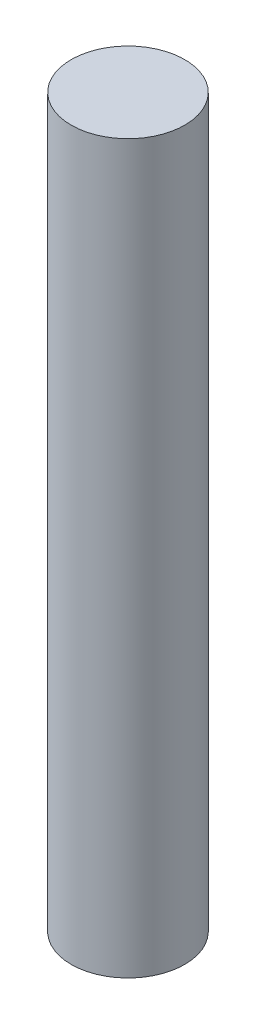
ISO-10303-21;
HEADER;
FILE_DESCRIPTION(('STEP AP214'),'2;1');
FILE_NAME('part.step','',(''),(''),'','','');
FILE_SCHEMA(('AUTOMOTIVE_DESIGN { 1 0 10303 214 1 1 1 1 }'));
ENDSEC;
DATA;
#1=APPLICATION_CONTEXT('core data for automotive mechanical design processes');
#2=APPLICATION_PROTOCOL_DEFINITION('international standard','automotive_design',2000,#1);
#3=PRODUCT_CONTEXT('',#1,'mechanical');
#4=PRODUCT('Part','Part','',(#3));
#5=PRODUCT_RELATED_PRODUCT_CATEGORY('part','',(#4));
#6=PRODUCT_DEFINITION_FORMATION('','',#4);
#7=PRODUCT_DEFINITION_CONTEXT('part definition',#1,'design');
#8=PRODUCT_DEFINITION('design','',#6,#7);
#9=PRODUCT_DEFINITION_SHAPE('','',#8);
#10=(LENGTH_UNIT() NAMED_UNIT(*) SI_UNIT(.MILLI.,.METRE.));
#11=(NAMED_UNIT(*) PLANE_ANGLE_UNIT() SI_UNIT($,.RADIAN.));
#12=(NAMED_UNIT(*) SI_UNIT($,.STERADIAN.) SOLID_ANGLE_UNIT());
#13=UNCERTAINTY_MEASURE_WITH_UNIT(LENGTH_MEASURE(1.E-05),#10,'distance_accuracy_value','');
#14=(GEOMETRIC_REPRESENTATION_CONTEXT(3) GLOBAL_UNCERTAINTY_ASSIGNED_CONTEXT((#13)) GLOBAL_UNIT_ASSIGNED_CONTEXT((#10,
#11,#12)) REPRESENTATION_CONTEXT('',''));
#15=CARTESIAN_POINT('',(0.,0.,0.));
#16=DIRECTION('',(0.,0.,1.));
#17=DIRECTION('',(1.,0.,0.));
#18=AXIS2_PLACEMENT_3D('',#15,#16,#17);
#19=CARTESIAN_POINT('',(-25.6160538057942,32.,-7.18996055685361));
#20=DIRECTION('',(0.,-1.,0.));
#21=DIRECTION('',(0.,0.,-1.));
#22=AXIS2_PLACEMENT_3D('',#19,#20,#21);
#23=CYLINDRICAL_SURFACE('',#22,2.5);
#24=CARTESIAN_POINT('',(-25.6160538057942,32.,-7.18996055685361));
#25=DIRECTION('',(0.,1.,0.));
#26=DIRECTION('',(0.,0.,1.));
#27=AXIS2_PLACEMENT_3D('',#24,#25,#26);
#28=CIRCLE('',#27,2.5);
#29=CARTESIAN_POINT('',(-25.6160538057942,32.,-4.68996055685361));
#30=VERTEX_POINT('',#29);
#31=EDGE_CURVE('E10',#30,#30,#28,.T.);
#32=ORIENTED_EDGE('',*,*,#31,.F.);
#33=EDGE_LOOP('',(#32));
#34=FACE_BOUND('',#33,.T.);
#35=CARTESIAN_POINT('',(-25.6160538057942,0.,-7.18996055685361));
#36=DIRECTION('',(0.,1.,0.));
#37=DIRECTION('',(0.,0.,1.));
#38=AXIS2_PLACEMENT_3D('',#35,#36,#37);
#39=CIRCLE('',#38,2.5);
#40=CARTESIAN_POINT('',(-25.6160538057942,0.,-4.68996055685361));
#41=VERTEX_POINT('',#40);
#42=EDGE_CURVE('E40',#41,#41,#39,.T.);
#43=ORIENTED_EDGE('',*,*,#42,.T.);
#44=EDGE_LOOP('',(#43));
#45=FACE_BOUND('',#44,.T.);
#46=ADVANCED_FACE('F37',(#34,#45),#23,.T.);
#47=CARTESIAN_POINT('',(-25.6160538057942,32.,-7.18996055685361));
#48=DIRECTION('',(0.,1.,0.));
#49=DIRECTION('',(0.,0.,1.));
#50=AXIS2_PLACEMENT_3D('',#47,#48,#49);
#51=PLANE('',#50);
#52=ORIENTED_EDGE('',*,*,#31,.T.);
#53=EDGE_LOOP('',(#52));
#54=FACE_BOUND('',#53,.T.);
#55=ADVANCED_FACE('F54',(#54),#51,.T.);
#56=CARTESIAN_POINT('',(-25.6160538057942,0.,-7.18996055685361));
#57=DIRECTION('',(0.,1.,0.));
#58=DIRECTION('',(0.,0.,1.));
#59=AXIS2_PLACEMENT_3D('',#56,#57,#58);
#60=PLANE('',#59);
#61=ORIENTED_EDGE('',*,*,#42,.F.);
#62=EDGE_LOOP('',(#61));
#63=FACE_BOUND('',#62,.T.);
#64=ADVANCED_FACE('F52',(#63),#60,.F.);
#65=CLOSED_SHELL('',(#46,#55,#64));
#66=MANIFOLD_SOLID_BREP('B2',#65);
#67=ADVANCED_BREP_SHAPE_REPRESENTATION('',(#18,#66),#14);
#68=SHAPE_DEFINITION_REPRESENTATION(#9,#67);
ENDSEC;
END-ISO-10303-21;
